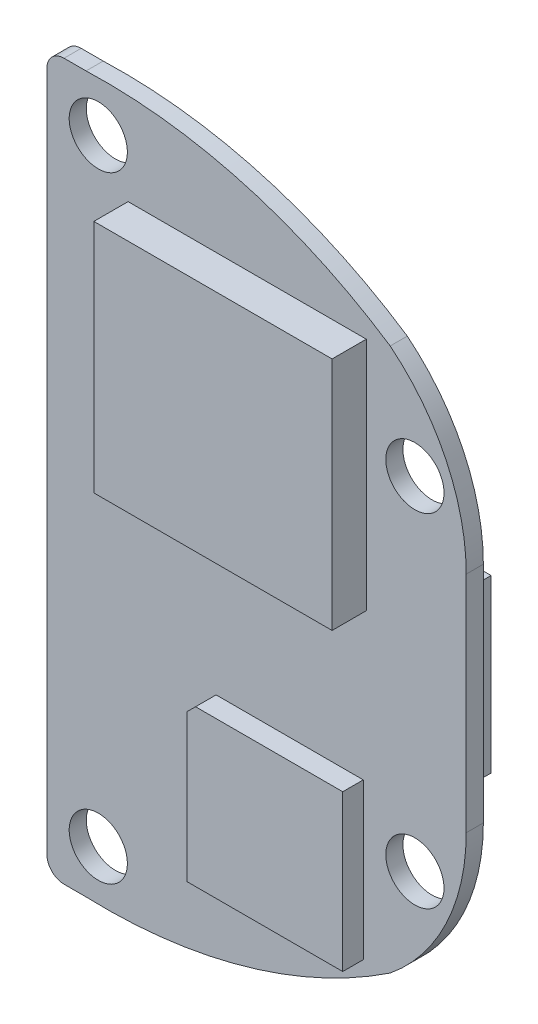
ISO-10303-21;
HEADER;
FILE_DESCRIPTION(('STEP AP214'),'2;1');
FILE_NAME('part.step','',(''),(''),'','','');
FILE_SCHEMA(('AUTOMOTIVE_DESIGN { 1 0 10303 214 1 1 1 1 }'));
ENDSEC;
DATA;
#1=APPLICATION_CONTEXT('core data for automotive mechanical design processes');
#2=APPLICATION_PROTOCOL_DEFINITION('international standard','automotive_design',2000,#1);
#3=PRODUCT_CONTEXT('',#1,'mechanical');
#4=PRODUCT('Part','Part','',(#3));
#5=PRODUCT_RELATED_PRODUCT_CATEGORY('part','',(#4));
#6=PRODUCT_DEFINITION_FORMATION('','',#4);
#7=PRODUCT_DEFINITION_CONTEXT('part definition',#1,'design');
#8=PRODUCT_DEFINITION('design','',#6,#7);
#9=PRODUCT_DEFINITION_SHAPE('','',#8);
#10=(LENGTH_UNIT() NAMED_UNIT(*) SI_UNIT(.MILLI.,.METRE.));
#11=(NAMED_UNIT(*) PLANE_ANGLE_UNIT() SI_UNIT($,.RADIAN.));
#12=(NAMED_UNIT(*) SI_UNIT($,.STERADIAN.) SOLID_ANGLE_UNIT());
#13=UNCERTAINTY_MEASURE_WITH_UNIT(LENGTH_MEASURE(1.E-05),#10,'distance_accuracy_value','');
#14=(GEOMETRIC_REPRESENTATION_CONTEXT(3) GLOBAL_UNCERTAINTY_ASSIGNED_CONTEXT((#13)) GLOBAL_UNIT_ASSIGNED_CONTEXT((#10,
#11,#12)) REPRESENTATION_CONTEXT('',''));
#15=CARTESIAN_POINT('',(0.,0.,0.));
#16=DIRECTION('',(0.,0.,1.));
#17=DIRECTION('',(1.,0.,0.));
#18=AXIS2_PLACEMENT_3D('',#15,#16,#17);
#19=CARTESIAN_POINT('',(0.,0.,1.7));
#20=DIRECTION('',(0.,0.,1.));
#21=DIRECTION('',(1.,0.,0.));
#22=AXIS2_PLACEMENT_3D('',#19,#20,#21);
#23=PLANE('',#22);
#24=DIRECTION('',(1.,0.,0.));
#25=VECTOR('',#24,1.);
#26=CARTESIAN_POINT('',(7.983496,-6.87576,1.7));
#27=LINE('',#26,#25);
#28=CARTESIAN_POINT('',(7.983496,-6.87576,1.7));
#29=VERTEX_POINT('',#28);
#30=CARTESIAN_POINT('',(-0.616436,-6.87576,1.7));
#31=VERTEX_POINT('',#30);
#32=EDGE_CURVE('E353',#29,#31,#27,.F.);
#33=ORIENTED_EDGE('',*,*,#32,.T.);
#34=DIRECTION('',(0.707106781186545,0.70710678118655,0.));
#35=VECTOR('',#34,1.);
#36=CARTESIAN_POINT('',(-0.616436,-6.87576,1.7));
#37=LINE('',#36,#35);
#38=CARTESIAN_POINT('',(-1.116308,-7.375632,1.7));
#39=VERTEX_POINT('',#38);
#40=EDGE_CURVE('E359',#31,#39,#37,.F.);
#41=ORIENTED_EDGE('',*,*,#40,.T.);
#42=DIRECTION('',(0.,1.,0.));
#43=VECTOR('',#42,1.);
#44=CARTESIAN_POINT('',(-1.116308,-7.375632,1.7));
#45=LINE('',#44,#43);
#46=CARTESIAN_POINT('',(-1.116308,-15.975564,1.7));
#47=VERTEX_POINT('',#46);
#48=EDGE_CURVE('E195',#39,#47,#45,.F.);
#49=ORIENTED_EDGE('',*,*,#48,.T.);
#50=DIRECTION('',(1.,0.,0.));
#51=VECTOR('',#50,1.);
#52=CARTESIAN_POINT('',(-1.116308,-15.975564,1.7));
#53=LINE('',#52,#51);
#54=CARTESIAN_POINT('',(7.983496,-15.975564,1.7));
#55=VERTEX_POINT('',#54);
#56=EDGE_CURVE('E177',#47,#55,#53,.T.);
#57=ORIENTED_EDGE('',*,*,#56,.T.);
#58=DIRECTION('',(0.,1.,0.));
#59=VECTOR('',#58,1.);
#60=CARTESIAN_POINT('',(7.983496,-15.975564,1.7));
#61=LINE('',#60,#59);
#62=EDGE_CURVE('E183',#55,#29,#61,.T.);
#63=ORIENTED_EDGE('',*,*,#62,.T.);
#64=EDGE_LOOP('',(#33,#41,#49,#57,#63));
#65=FACE_BOUND('',#64,.T.);
#66=ADVANCED_FACE('F17',(#65),#23,.T.);
#67=CARTESIAN_POINT('',(0.,0.,2.5));
#68=DIRECTION('',(0.,0.,-1.));
#69=DIRECTION('',(-1.,0.,0.));
#70=AXIS2_PLACEMENT_3D('',#67,#68,#69);
#71=PLANE('',#70);
#72=DIRECTION('',(0.,1.,0.));
#73=VECTOR('',#72,1.);
#74=CARTESIAN_POINT('',(8.161042,15.513578,2.5));
#75=LINE('',#74,#73);
#76=CARTESIAN_POINT('',(8.161042,1.773448,2.5));
#77=VERTEX_POINT('',#76);
#78=CARTESIAN_POINT('',(8.161042,15.513578,2.5));
#79=VERTEX_POINT('',#78);
#80=EDGE_CURVE('E345',#77,#79,#75,.T.);
#81=ORIENTED_EDGE('',*,*,#80,.T.);
#82=DIRECTION('',(1.,0.,0.));
#83=VECTOR('',#82,1.);
#84=CARTESIAN_POINT('',(-5.75892,15.513578,2.5));
#85=LINE('',#84,#83);
#86=CARTESIAN_POINT('',(-5.75892,15.513578,2.5));
#87=VERTEX_POINT('',#86);
#88=EDGE_CURVE('E348',#79,#87,#85,.F.);
#89=ORIENTED_EDGE('',*,*,#88,.T.);
#90=DIRECTION('',(0.,1.,0.));
#91=VECTOR('',#90,1.);
#92=CARTESIAN_POINT('',(-5.75892,1.773448,2.5));
#93=LINE('',#92,#91);
#94=CARTESIAN_POINT('',(-5.75892,1.773448,2.5));
#95=VERTEX_POINT('',#94);
#96=EDGE_CURVE('E330',#87,#95,#93,.F.);
#97=ORIENTED_EDGE('',*,*,#96,.T.);
#98=DIRECTION('',(1.,0.,0.));
#99=VECTOR('',#98,1.);
#100=CARTESIAN_POINT('',(8.161042,1.773448,2.5));
#101=LINE('',#100,#99);
#102=EDGE_CURVE('E339',#95,#77,#101,.T.);
#103=ORIENTED_EDGE('',*,*,#102,.T.);
#104=EDGE_LOOP('',(#81,#89,#97,#103));
#105=FACE_BOUND('',#104,.T.);
#106=ADVANCED_FACE('F492',(#105),#71,.F.);
#107=CARTESIAN_POINT('',(7.983496,-15.975564,1.7));
#108=DIRECTION('',(-1.,0.,0.));
#109=DIRECTION('',(0.,0.,1.));
#110=AXIS2_PLACEMENT_3D('',#107,#108,#109);
#111=PLANE('',#110);
#112=DIRECTION('',(0.,0.,-1.));
#113=VECTOR('',#112,1.);
#114=CARTESIAN_POINT('',(7.983496,-6.87576,1.7));
#115=LINE('',#114,#113);
#116=CARTESIAN_POINT('',(7.983496,-6.87576,0.5));
#117=VERTEX_POINT('',#116);
#118=EDGE_CURVE('E188',#117,#29,#115,.F.);
#119=ORIENTED_EDGE('',*,*,#118,.T.);
#120=ORIENTED_EDGE('',*,*,#62,.F.);
#121=DIRECTION('',(0.,0.,1.));
#122=VECTOR('',#121,1.);
#123=CARTESIAN_POINT('',(7.983496,-15.975564,1.7));
#124=LINE('',#123,#122);
#125=CARTESIAN_POINT('',(7.983496,-15.975564,0.5));
#126=VERTEX_POINT('',#125);
#127=EDGE_CURVE('E186',#55,#126,#124,.F.);
#128=ORIENTED_EDGE('',*,*,#127,.T.);
#129=DIRECTION('',(0.,1.,0.));
#130=VECTOR('',#129,1.);
#131=CARTESIAN_POINT('',(7.983496,0.,0.5));
#132=LINE('',#131,#130);
#133=EDGE_CURVE('E317',#117,#126,#132,.F.);
#134=ORIENTED_EDGE('',*,*,#133,.F.);
#135=EDGE_LOOP('',(#119,#120,#128,#134));
#136=FACE_BOUND('',#135,.T.);
#137=ADVANCED_FACE('F184',(#136),#111,.F.);
#138=CARTESIAN_POINT('',(-1.116308,-15.975564,1.7));
#139=DIRECTION('',(0.,1.,0.));
#140=DIRECTION('',(0.,0.,1.));
#141=AXIS2_PLACEMENT_3D('',#138,#139,#140);
#142=PLANE('',#141);
#143=ORIENTED_EDGE('',*,*,#56,.F.);
#144=DIRECTION('',(0.,0.,-1.));
#145=VECTOR('',#144,1.);
#146=CARTESIAN_POINT('',(-1.116308,-15.975564,1.7));
#147=LINE('',#146,#145);
#148=CARTESIAN_POINT('',(-1.116308,-15.975564,0.5));
#149=VERTEX_POINT('',#148);
#150=EDGE_CURVE('E361',#47,#149,#147,.T.);
#151=ORIENTED_EDGE('',*,*,#150,.T.);
#152=DIRECTION('',(1.,0.,0.));
#153=VECTOR('',#152,1.);
#154=CARTESIAN_POINT('',(0.,-15.975564,0.5));
#155=LINE('',#154,#153);
#156=EDGE_CURVE('E194',#126,#149,#155,.F.);
#157=ORIENTED_EDGE('',*,*,#156,.F.);
#158=ORIENTED_EDGE('',*,*,#127,.F.);
#159=EDGE_LOOP('',(#143,#151,#157,#158));
#160=FACE_BOUND('',#159,.T.);
#161=ADVANCED_FACE('F193',(#160),#142,.F.);
#162=CARTESIAN_POINT('',(-1.116308,-7.375632,1.7));
#163=DIRECTION('',(1.,0.,0.));
#164=DIRECTION('',(0.,0.,-1.));
#165=AXIS2_PLACEMENT_3D('',#162,#163,#164);
#166=PLANE('',#165);
#167=ORIENTED_EDGE('',*,*,#150,.F.);
#168=ORIENTED_EDGE('',*,*,#48,.F.);
#169=DIRECTION('',(0.,0.,1.));
#170=VECTOR('',#169,1.);
#171=CARTESIAN_POINT('',(-1.116308,-7.375632,1.7));
#172=LINE('',#171,#170);
#173=CARTESIAN_POINT('',(-1.116308,-7.375632,0.5));
#174=VERTEX_POINT('',#173);
#175=EDGE_CURVE('E356',#39,#174,#172,.F.);
#176=ORIENTED_EDGE('',*,*,#175,.T.);
#177=DIRECTION('',(0.,1.,0.));
#178=VECTOR('',#177,1.);
#179=CARTESIAN_POINT('',(-1.116308,0.,0.5));
#180=LINE('',#179,#178);
#181=EDGE_CURVE('E314',#149,#174,#180,.T.);
#182=ORIENTED_EDGE('',*,*,#181,.F.);
#183=EDGE_LOOP('',(#167,#168,#176,#182));
#184=FACE_BOUND('',#183,.T.);
#185=ADVANCED_FACE('F364',(#184),#166,.F.);
#186=CARTESIAN_POINT('',(-0.616436,-6.87576,1.7));
#187=DIRECTION('',(0.70710678118655,-0.707106781186545,0.));
#188=DIRECTION('',(0.707106781186545,0.70710678118655,0.));
#189=AXIS2_PLACEMENT_3D('',#186,#187,#188);
#190=PLANE('',#189);
#191=ORIENTED_EDGE('',*,*,#40,.F.);
#192=DIRECTION('',(0.,0.,-1.));
#193=VECTOR('',#192,1.);
#194=CARTESIAN_POINT('',(-0.616436,-6.87576,1.7));
#195=LINE('',#194,#193);
#196=CARTESIAN_POINT('',(-0.616436,-6.87576,0.5));
#197=VERTEX_POINT('',#196);
#198=EDGE_CURVE('E350',#31,#197,#195,.T.);
#199=ORIENTED_EDGE('',*,*,#198,.T.);
#200=DIRECTION('',(0.707106781186544,0.707106781186551,0.));
#201=VECTOR('',#200,1.);
#202=CARTESIAN_POINT('',(-1.116308,-7.375632,0.5));
#203=LINE('',#202,#201);
#204=EDGE_CURVE('E312',#174,#197,#203,.T.);
#205=ORIENTED_EDGE('',*,*,#204,.F.);
#206=ORIENTED_EDGE('',*,*,#175,.F.);
#207=EDGE_LOOP('',(#191,#199,#205,#206));
#208=FACE_BOUND('',#207,.T.);
#209=ADVANCED_FACE('F374',(#208),#190,.F.);
#210=CARTESIAN_POINT('',(7.983496,-6.87576,1.7));
#211=DIRECTION('',(0.,-1.,0.));
#212=DIRECTION('',(0.,0.,-1.));
#213=AXIS2_PLACEMENT_3D('',#210,#211,#212);
#214=PLANE('',#213);
#215=ORIENTED_EDGE('',*,*,#32,.F.);
#216=ORIENTED_EDGE('',*,*,#118,.F.);
#217=DIRECTION('',(1.,0.,0.));
#218=VECTOR('',#217,1.);
#219=CARTESIAN_POINT('',(0.,-6.87576,0.5));
#220=LINE('',#219,#218);
#221=EDGE_CURVE('E309',#197,#117,#220,.T.);
#222=ORIENTED_EDGE('',*,*,#221,.F.);
#223=ORIENTED_EDGE('',*,*,#198,.F.);
#224=EDGE_LOOP('',(#215,#216,#222,#223));
#225=FACE_BOUND('',#224,.T.);
#226=ADVANCED_FACE('F372',(#225),#214,.F.);
#227=CARTESIAN_POINT('',(-5.75892,15.513578,2.5));
#228=DIRECTION('',(0.,-1.,0.));
#229=DIRECTION('',(0.,0.,-1.));
#230=AXIS2_PLACEMENT_3D('',#227,#228,#229);
#231=PLANE('',#230);
#232=ORIENTED_EDGE('',*,*,#88,.F.);
#233=DIRECTION('',(0.,0.,1.));
#234=VECTOR('',#233,1.);
#235=CARTESIAN_POINT('',(8.161042,15.513578,2.5));
#236=LINE('',#235,#234);
#237=CARTESIAN_POINT('',(8.161042,15.513578,0.5));
#238=VERTEX_POINT('',#237);
#239=EDGE_CURVE('E342',#79,#238,#236,.F.);
#240=ORIENTED_EDGE('',*,*,#239,.T.);
#241=DIRECTION('',(1.,0.,0.));
#242=VECTOR('',#241,1.);
#243=CARTESIAN_POINT('',(0.,15.513578,0.5));
#244=LINE('',#243,#242);
#245=CARTESIAN_POINT('',(-5.75892,15.513578,0.5));
#246=VERTEX_POINT('',#245);
#247=EDGE_CURVE('E307',#246,#238,#244,.T.);
#248=ORIENTED_EDGE('',*,*,#247,.F.);
#249=DIRECTION('',(0.,0.,-1.));
#250=VECTOR('',#249,1.);
#251=CARTESIAN_POINT('',(-5.75892,15.513578,2.5));
#252=LINE('',#251,#250);
#253=EDGE_CURVE('E333',#246,#87,#252,.F.);
#254=ORIENTED_EDGE('',*,*,#253,.T.);
#255=EDGE_LOOP('',(#232,#240,#248,#254));
#256=FACE_BOUND('',#255,.T.);
#257=ADVANCED_FACE('F382',(#256),#231,.F.);
#258=CARTESIAN_POINT('',(8.161042,15.513578,2.5));
#259=DIRECTION('',(-1.,0.,0.));
#260=DIRECTION('',(0.,0.,1.));
#261=AXIS2_PLACEMENT_3D('',#258,#259,#260);
#262=PLANE('',#261);
#263=ORIENTED_EDGE('',*,*,#80,.F.);
#264=DIRECTION('',(0.,0.,1.));
#265=VECTOR('',#264,1.);
#266=CARTESIAN_POINT('',(8.161042,1.773448,2.5));
#267=LINE('',#266,#265);
#268=CARTESIAN_POINT('',(8.161042,1.773448,0.5));
#269=VERTEX_POINT('',#268);
#270=EDGE_CURVE('E336',#77,#269,#267,.F.);
#271=ORIENTED_EDGE('',*,*,#270,.T.);
#272=DIRECTION('',(0.,1.,0.));
#273=VECTOR('',#272,1.);
#274=CARTESIAN_POINT('',(8.161042,0.,0.5));
#275=LINE('',#274,#273);
#276=EDGE_CURVE('E305',#238,#269,#275,.F.);
#277=ORIENTED_EDGE('',*,*,#276,.F.);
#278=ORIENTED_EDGE('',*,*,#239,.F.);
#279=EDGE_LOOP('',(#263,#271,#277,#278));
#280=FACE_BOUND('',#279,.T.);
#281=ADVANCED_FACE('F477',(#280),#262,.F.);
#282=CARTESIAN_POINT('',(8.161042,1.773448,2.5));
#283=DIRECTION('',(0.,1.,0.));
#284=DIRECTION('',(0.,0.,1.));
#285=AXIS2_PLACEMENT_3D('',#282,#283,#284);
#286=PLANE('',#285);
#287=ORIENTED_EDGE('',*,*,#102,.F.);
#288=DIRECTION('',(0.,0.,-1.));
#289=VECTOR('',#288,1.);
#290=CARTESIAN_POINT('',(-5.75892,1.773448,2.5));
#291=LINE('',#290,#289);
#292=CARTESIAN_POINT('',(-5.75892,1.773448,0.5));
#293=VERTEX_POINT('',#292);
#294=EDGE_CURVE('E319',#95,#293,#291,.T.);
#295=ORIENTED_EDGE('',*,*,#294,.T.);
#296=DIRECTION('',(1.,0.,0.));
#297=VECTOR('',#296,1.);
#298=CARTESIAN_POINT('',(0.,1.773448,0.5));
#299=LINE('',#298,#297);
#300=EDGE_CURVE('E303',#269,#293,#299,.F.);
#301=ORIENTED_EDGE('',*,*,#300,.F.);
#302=ORIENTED_EDGE('',*,*,#270,.F.);
#303=EDGE_LOOP('',(#287,#295,#301,#302));
#304=FACE_BOUND('',#303,.T.);
#305=ADVANCED_FACE('F473',(#304),#286,.F.);
#306=CARTESIAN_POINT('',(-5.75892,1.773448,2.5));
#307=DIRECTION('',(1.,0.,0.));
#308=DIRECTION('',(0.,0.,-1.));
#309=AXIS2_PLACEMENT_3D('',#306,#307,#308);
#310=PLANE('',#309);
#311=ORIENTED_EDGE('',*,*,#96,.F.);
#312=ORIENTED_EDGE('',*,*,#253,.F.);
#313=DIRECTION('',(0.,1.,0.));
#314=VECTOR('',#313,1.);
#315=CARTESIAN_POINT('',(-5.75892,0.,0.5));
#316=LINE('',#315,#314);
#317=EDGE_CURVE('E300',#293,#246,#316,.T.);
#318=ORIENTED_EDGE('',*,*,#317,.F.);
#319=ORIENTED_EDGE('',*,*,#294,.F.);
#320=EDGE_LOOP('',(#311,#312,#318,#319));
#321=FACE_BOUND('',#320,.T.);
#322=ADVANCED_FACE('F469',(#321),#310,.F.);
#323=CARTESIAN_POINT('',(0.,0.,-1.7));
#324=DIRECTION('',(0.,0.,-1.));
#325=DIRECTION('',(-1.,0.,0.));
#326=AXIS2_PLACEMENT_3D('',#323,#324,#325);
#327=PLANE('',#326);
#328=DIRECTION('',(0.,1.,0.));
#329=VECTOR('',#328,1.);
#330=CARTESIAN_POINT('',(13.250186,5.00001000000001,-1.7));
#331=LINE('',#330,#329);
#332=CARTESIAN_POINT('',(13.250186,5.00001000000001,-1.7));
#333=VERTEX_POINT('',#332);
#334=CARTESIAN_POINT('',(13.250186,-4.99997,-1.7));
#335=VERTEX_POINT('',#334);
#336=EDGE_CURVE('E111',#333,#335,#331,.F.);
#337=ORIENTED_EDGE('',*,*,#336,.T.);
#338=DIRECTION('',(1.,0.,0.));
#339=VECTOR('',#338,1.);
#340=CARTESIAN_POINT('',(13.250186,-4.99997,-1.7));
#341=LINE('',#340,#339);
#342=CARTESIAN_POINT('',(2.650004,-4.99997,-1.7));
#343=VERTEX_POINT('',#342);
#344=EDGE_CURVE('E295',#335,#343,#341,.F.);
#345=ORIENTED_EDGE('',*,*,#344,.T.);
#346=DIRECTION('',(0.,1.,0.));
#347=VECTOR('',#346,1.);
#348=CARTESIAN_POINT('',(2.650004,5.00001000000001,-1.7));
#349=LINE('',#348,#347);
#350=CARTESIAN_POINT('',(2.650004,5.00001000000001,-1.7));
#351=VERTEX_POINT('',#350);
#352=EDGE_CURVE('E290',#343,#351,#349,.T.);
#353=ORIENTED_EDGE('',*,*,#352,.T.);
#354=DIRECTION('',(1.,0.,0.));
#355=VECTOR('',#354,1.);
#356=CARTESIAN_POINT('',(13.250186,5.00001000000001,-1.7));
#357=LINE('',#356,#355);
#358=EDGE_CURVE('E277',#351,#333,#357,.T.);
#359=ORIENTED_EDGE('',*,*,#358,.T.);
#360=EDGE_LOOP('',(#337,#345,#353,#359));
#361=FACE_BOUND('',#360,.T.);
#362=ADVANCED_FACE('F465',(#361),#327,.T.);
#363=CARTESIAN_POINT('',(0.,0.,0.5));
#364=DIRECTION('',(0.,0.,1.));
#365=DIRECTION('',(1.,0.,0.));
#366=AXIS2_PLACEMENT_3D('',#363,#364,#365);
#367=PLANE('',#366);
#368=ORIENTED_EDGE('',*,*,#300,.T.);
#369=ORIENTED_EDGE('',*,*,#317,.T.);
#370=ORIENTED_EDGE('',*,*,#247,.T.);
#371=ORIENTED_EDGE('',*,*,#276,.T.);
#372=EDGE_LOOP('',(#368,#369,#370,#371));
#373=FACE_BOUND('',#372,.T.);
#374=CARTESIAN_POINT('',(11.,10.,0.5));
#375=DIRECTION('',(0.,0.,1.));
#376=DIRECTION('',(1.,0.,0.));
#377=AXIS2_PLACEMENT_3D('',#374,#375,#376);
#378=CIRCLE('',#377,1.7);
#379=CARTESIAN_POINT('',(12.7,10.,0.5));
#380=VERTEX_POINT('',#379);
#381=EDGE_CURVE('E263',#380,#380,#378,.F.);
#382=ORIENTED_EDGE('',*,*,#381,.T.);
#383=EDGE_LOOP('',(#382));
#384=FACE_BOUND('',#383,.T.);
#385=CARTESIAN_POINT('',(11.,-10.,0.5));
#386=DIRECTION('',(0.,0.,1.));
#387=DIRECTION('',(1.,0.,0.));
#388=AXIS2_PLACEMENT_3D('',#385,#386,#387);
#389=CIRCLE('',#388,1.7);
#390=CARTESIAN_POINT('',(12.7,-10.,0.5));
#391=VERTEX_POINT('',#390);
#392=EDGE_CURVE('E265',#391,#391,#389,.F.);
#393=ORIENTED_EDGE('',*,*,#392,.T.);
#394=EDGE_LOOP('',(#393));
#395=FACE_BOUND('',#394,.T.);
#396=CARTESIAN_POINT('',(-7.5,18.,0.5));
#397=DIRECTION('',(0.,0.,1.));
#398=DIRECTION('',(1.,0.,0.));
#399=AXIS2_PLACEMENT_3D('',#396,#397,#398);
#400=CIRCLE('',#399,1.7);
#401=CARTESIAN_POINT('',(-5.8,18.,0.5));
#402=VERTEX_POINT('',#401);
#403=EDGE_CURVE('E234',#402,#402,#400,.F.);
#404=ORIENTED_EDGE('',*,*,#403,.T.);
#405=EDGE_LOOP('',(#404));
#406=FACE_BOUND('',#405,.T.);
#407=CARTESIAN_POINT('',(-7.49999999999999,-18.,0.5));
#408=DIRECTION('',(0.,0.,1.));
#409=DIRECTION('',(1.,0.,0.));
#410=AXIS2_PLACEMENT_3D('',#407,#408,#409);
#411=CIRCLE('',#410,1.7);
#412=CARTESIAN_POINT('',(-5.79999999999999,-18.,0.5));
#413=VERTEX_POINT('',#412);
#414=EDGE_CURVE('E20',#413,#413,#411,.F.);
#415=ORIENTED_EDGE('',*,*,#414,.T.);
#416=EDGE_LOOP('',(#415));
#417=FACE_BOUND('',#416,.T.);
#418=DIRECTION('',(-1.,0.,0.));
#419=VECTOR('',#418,1.);
#420=CARTESIAN_POINT('',(-8.21382999999999,20.900156,0.5));
#421=LINE('',#420,#419);
#422=CARTESIAN_POINT('',(-9.500086,20.900156,0.5));
#423=VERTEX_POINT('',#422);
#424=CARTESIAN_POINT('',(-8.21383000000021,20.900156,0.5));
#425=VERTEX_POINT('',#424);
#426=EDGE_CURVE('E102',#423,#425,#421,.F.);
#427=ORIENTED_EDGE('',*,*,#426,.F.);
#428=CARTESIAN_POINT('',(-9.50002926400854,19.9001012640085,0.5));
#429=DIRECTION('',(0.,0.,1.));
#430=DIRECTION('',(1.,0.,0.));
#431=AXIS2_PLACEMENT_3D('',#428,#429,#430);
#432=CIRCLE('',#431,1.00005473760086);
#433=CARTESIAN_POINT('',(-10.5,19.9130629521172,0.5));
#434=VERTEX_POINT('',#433);
#435=EDGE_CURVE('E255',#434,#423,#432,.F.);
#436=ORIENTED_EDGE('',*,*,#435,.F.);
#437=DIRECTION('',(0.,1.,0.));
#438=VECTOR('',#437,1.);
#439=CARTESIAN_POINT('',(-10.5,17.5,0.5));
#440=LINE('',#439,#438);
#441=CARTESIAN_POINT('',(-10.5,-19.9128093166315,0.5));
#442=VERTEX_POINT('',#441);
#443=EDGE_CURVE('E258',#434,#442,#440,.F.);
#444=ORIENTED_EDGE('',*,*,#443,.T.);
#445=CARTESIAN_POINT('',(-9.50007000687302,-19.899848006873,0.5));
#446=DIRECTION('',(0.,0.,1.));
#447=DIRECTION('',(1.,0.,0.));
#448=AXIS2_PLACEMENT_3D('',#445,#446,#447);
#449=CIRCLE('',#448,1.00001399325488);
#450=CARTESIAN_POINT('',(-9.500086,-20.899862,0.5));
#451=VERTEX_POINT('',#450);
#452=EDGE_CURVE('E250',#451,#442,#449,.F.);
#453=ORIENTED_EDGE('',*,*,#452,.F.);
#454=DIRECTION('',(1.,0.,0.));
#455=VECTOR('',#454,1.);
#456=CARTESIAN_POINT('',(-9.500086,-20.899862,0.5));
#457=LINE('',#456,#455);
#458=CARTESIAN_POINT('',(-8.21382999999998,-20.899862,0.5));
#459=VERTEX_POINT('',#458);
#460=EDGE_CURVE('E322',#459,#451,#457,.F.);
#461=ORIENTED_EDGE('',*,*,#460,.F.);
#462=CARTESIAN_POINT('',(-7.15900252002462,9.26161934420806,0.5));
#463=DIRECTION('',(0.,0.,1.));
#464=DIRECTION('',(1.,0.,0.));
#465=AXIS2_PLACEMENT_3D('',#462,#463,#464);
#466=CIRCLE('',#465,30.1799207734136);
#467=CARTESIAN_POINT('',(9.55397800000002,-15.868122,0.5));
#468=VERTEX_POINT('',#467);
#469=EDGE_CURVE('E246',#468,#459,#466,.F.);
#470=ORIENTED_EDGE('',*,*,#469,.F.);
#471=CARTESIAN_POINT('',(2.00001708960865,-6.54411425412743,0.5));
#472=DIRECTION('',(0.,0.,1.));
#473=DIRECTION('',(1.,0.,0.));
#474=AXIS2_PLACEMENT_3D('',#471,#472,#473);
#475=CIRCLE('',#474,11.9999769116783);
#476=CARTESIAN_POINT('',(13.999994,-6.54429,0.5));
#477=VERTEX_POINT('',#476);
#478=EDGE_CURVE('E242',#477,#468,#475,.F.);
#479=ORIENTED_EDGE('',*,*,#478,.F.);
#480=DIRECTION('',(0.,1.,0.));
#481=VECTOR('',#480,1.);
#482=CARTESIAN_POINT('',(13.999994,-6.54429,0.5));
#483=LINE('',#482,#481);
#484=CARTESIAN_POINT('',(13.9999940000003,6.54433359535493,0.5));
#485=VERTEX_POINT('',#484);
#486=EDGE_CURVE('E320',#485,#477,#483,.F.);
#487=ORIENTED_EDGE('',*,*,#486,.F.);
#488=CARTESIAN_POINT('',(2.0000351084364,6.54433359535492,0.5));
#489=DIRECTION('',(0.,0.,1.));
#490=DIRECTION('',(1.,0.,0.));
#491=AXIS2_PLACEMENT_3D('',#488,#489,#490);
#492=CIRCLE('',#491,11.9999588915641);
#493=CARTESIAN_POINT('',(9.55575599999998,15.866892,0.5));
#494=VERTEX_POINT('',#493);
#495=EDGE_CURVE('E239',#494,#485,#492,.F.);
#496=ORIENTED_EDGE('',*,*,#495,.F.);
#497=CARTESIAN_POINT('',(-7.15948767217951,-9.26133361884371,0.5));
#498=DIRECTION('',(0.,0.,1.));
#499=DIRECTION('',(1.,0.,0.));
#500=AXIS2_PLACEMENT_3D('',#497,#498,#499);
#501=CIRCLE('',#500,30.1799120901942);
#502=EDGE_CURVE('E260',#425,#494,#501,.F.);
#503=ORIENTED_EDGE('',*,*,#502,.F.);
#504=EDGE_LOOP('',(#427,#436,#444,#453,#461,#470,#479,#487,#496,#503));
#505=FACE_BOUND('',#504,.T.);
#506=ORIENTED_EDGE('',*,*,#204,.T.);
#507=ORIENTED_EDGE('',*,*,#221,.T.);
#508=ORIENTED_EDGE('',*,*,#133,.T.);
#509=ORIENTED_EDGE('',*,*,#156,.T.);
#510=ORIENTED_EDGE('',*,*,#181,.T.);
#511=EDGE_LOOP('',(#506,#507,#508,#509,#510));
#512=FACE_BOUND('',#511,.T.);
#513=ADVANCED_FACE('F368',(#373,#384,#395,#406,#417,#505,#512),#367,.T.);
#514=CARTESIAN_POINT('',(13.250186,5.00001000000001,-1.7));
#515=DIRECTION('',(-1.,0.,0.));
#516=DIRECTION('',(0.,0.,1.));
#517=AXIS2_PLACEMENT_3D('',#514,#515,#516);
#518=PLANE('',#517);
#519=ORIENTED_EDGE('',*,*,#336,.F.);
#520=DIRECTION('',(0.,0.,-1.));
#521=VECTOR('',#520,1.);
#522=CARTESIAN_POINT('',(13.250186,5.00001000000001,-1.7));
#523=LINE('',#522,#521);
#524=CARTESIAN_POINT('',(13.250186,5.00001000000001,-0.5));
#525=VERTEX_POINT('',#524);
#526=EDGE_CURVE('E271',#333,#525,#523,.F.);
#527=ORIENTED_EDGE('',*,*,#526,.T.);
#528=DIRECTION('',(0.,1.,0.));
#529=VECTOR('',#528,1.);
#530=CARTESIAN_POINT('',(13.250186,0.,-0.5));
#531=LINE('',#530,#529);
#532=CARTESIAN_POINT('',(13.250186,-4.99997,-0.5));
#533=VERTEX_POINT('',#532);
#534=EDGE_CURVE('E237',#525,#533,#531,.F.);
#535=ORIENTED_EDGE('',*,*,#534,.T.);
#536=DIRECTION('',(0.,0.,1.));
#537=VECTOR('',#536,1.);
#538=CARTESIAN_POINT('',(13.250186,-4.99997,-1.7));
#539=LINE('',#538,#537);
#540=EDGE_CURVE('E297',#533,#335,#539,.F.);
#541=ORIENTED_EDGE('',*,*,#540,.T.);
#542=EDGE_LOOP('',(#519,#527,#535,#541));
#543=FACE_BOUND('',#542,.T.);
#544=ADVANCED_FACE('F460',(#543),#518,.F.);
#545=CARTESIAN_POINT('',(13.250186,-4.99997,-1.7));
#546=DIRECTION('',(0.,1.,0.));
#547=DIRECTION('',(0.,0.,1.));
#548=AXIS2_PLACEMENT_3D('',#545,#546,#547);
#549=PLANE('',#548);
#550=ORIENTED_EDGE('',*,*,#344,.F.);
#551=ORIENTED_EDGE('',*,*,#540,.F.);
#552=DIRECTION('',(1.,0.,0.));
#553=VECTOR('',#552,1.);
#554=CARTESIAN_POINT('',(0.,-4.99997,-0.5));
#555=LINE('',#554,#553);
#556=CARTESIAN_POINT('',(2.650004,-4.99997,-0.5));
#557=VERTEX_POINT('',#556);
#558=EDGE_CURVE('E521',#533,#557,#555,.F.);
#559=ORIENTED_EDGE('',*,*,#558,.T.);
#560=DIRECTION('',(0.,0.,-1.));
#561=VECTOR('',#560,1.);
#562=CARTESIAN_POINT('',(2.650004,-4.99997,-1.7));
#563=LINE('',#562,#561);
#564=EDGE_CURVE('E292',#557,#343,#563,.T.);
#565=ORIENTED_EDGE('',*,*,#564,.T.);
#566=EDGE_LOOP('',(#550,#551,#559,#565));
#567=FACE_BOUND('',#566,.T.);
#568=ADVANCED_FACE('F456',(#567),#549,.F.);
#569=CARTESIAN_POINT('',(2.650004,5.00001000000001,-1.7));
#570=DIRECTION('',(1.,0.,0.));
#571=DIRECTION('',(0.,0.,-1.));
#572=AXIS2_PLACEMENT_3D('',#569,#570,#571);
#573=PLANE('',#572);
#574=ORIENTED_EDGE('',*,*,#352,.F.);
#575=ORIENTED_EDGE('',*,*,#564,.F.);
#576=DIRECTION('',(0.,1.,0.));
#577=VECTOR('',#576,1.);
#578=CARTESIAN_POINT('',(2.650004,0.,-0.5));
#579=LINE('',#578,#577);
#580=CARTESIAN_POINT('',(2.650004,5.00001000000001,-0.5));
#581=VERTEX_POINT('',#580);
#582=EDGE_CURVE('E524',#557,#581,#579,.T.);
#583=ORIENTED_EDGE('',*,*,#582,.T.);
#584=DIRECTION('',(0.,0.,-1.));
#585=VECTOR('',#584,1.);
#586=CARTESIAN_POINT('',(2.650004,5.00001000000001,-1.7));
#587=LINE('',#586,#585);
#588=EDGE_CURVE('E282',#581,#351,#587,.T.);
#589=ORIENTED_EDGE('',*,*,#588,.T.);
#590=EDGE_LOOP('',(#574,#575,#583,#589));
#591=FACE_BOUND('',#590,.T.);
#592=ADVANCED_FACE('F452',(#591),#573,.F.);
#593=CARTESIAN_POINT('',(13.250186,5.00001000000001,-1.7));
#594=DIRECTION('',(0.,-1.,0.));
#595=DIRECTION('',(0.,0.,-1.));
#596=AXIS2_PLACEMENT_3D('',#593,#594,#595);
#597=PLANE('',#596);
#598=ORIENTED_EDGE('',*,*,#358,.F.);
#599=ORIENTED_EDGE('',*,*,#588,.F.);
#600=DIRECTION('',(1.,0.,0.));
#601=VECTOR('',#600,1.);
#602=CARTESIAN_POINT('',(0.,5.00001000000001,-0.5));
#603=LINE('',#602,#601);
#604=EDGE_CURVE('E233',#581,#525,#603,.T.);
#605=ORIENTED_EDGE('',*,*,#604,.T.);
#606=ORIENTED_EDGE('',*,*,#526,.F.);
#607=EDGE_LOOP('',(#598,#599,#605,#606));
#608=FACE_BOUND('',#607,.T.);
#609=ADVANCED_FACE('F448',(#608),#597,.F.);
#610=CARTESIAN_POINT('',(-7.49999999999999,-18.,-1.5));
#611=DIRECTION('',(0.,0.,1.));
#612=DIRECTION('',(1.,0.,0.));
#613=AXIS2_PLACEMENT_3D('',#610,#611,#612);
#614=CYLINDRICAL_SURFACE('',#613,1.7);
#615=ORIENTED_EDGE('',*,*,#414,.F.);
#616=EDGE_LOOP('',(#615));
#617=FACE_BOUND('',#616,.T.);
#618=CARTESIAN_POINT('',(-7.49999999999999,-18.,-0.5));
#619=DIRECTION('',(0.,0.,1.));
#620=DIRECTION('',(1.,0.,0.));
#621=AXIS2_PLACEMENT_3D('',#618,#619,#620);
#622=CIRCLE('',#621,1.7);
#623=CARTESIAN_POINT('',(-5.79999999999999,-18.,-0.5));
#624=VERTEX_POINT('',#623);
#625=EDGE_CURVE('E230',#624,#624,#622,.F.);
#626=ORIENTED_EDGE('',*,*,#625,.T.);
#627=EDGE_LOOP('',(#626));
#628=FACE_BOUND('',#627,.T.);
#629=ADVANCED_FACE('F444',(#617,#628),#614,.F.);
#630=CARTESIAN_POINT('',(11.,-10.,-1.5));
#631=DIRECTION('',(0.,0.,1.));
#632=DIRECTION('',(1.,0.,0.));
#633=AXIS2_PLACEMENT_3D('',#630,#631,#632);
#634=CYLINDRICAL_SURFACE('',#633,1.7);
#635=ORIENTED_EDGE('',*,*,#392,.F.);
#636=EDGE_LOOP('',(#635));
#637=FACE_BOUND('',#636,.T.);
#638=CARTESIAN_POINT('',(11.,-10.,-0.5));
#639=DIRECTION('',(0.,0.,1.));
#640=DIRECTION('',(1.,0.,0.));
#641=AXIS2_PLACEMENT_3D('',#638,#639,#640);
#642=CIRCLE('',#641,1.7);
#643=CARTESIAN_POINT('',(12.7,-10.,-0.5));
#644=VERTEX_POINT('',#643);
#645=EDGE_CURVE('E227',#644,#644,#642,.F.);
#646=ORIENTED_EDGE('',*,*,#645,.T.);
#647=EDGE_LOOP('',(#646));
#648=FACE_BOUND('',#647,.T.);
#649=ADVANCED_FACE('F440',(#637,#648),#634,.F.);
#650=CARTESIAN_POINT('',(11.,10.,-1.5));
#651=DIRECTION('',(0.,0.,1.));
#652=DIRECTION('',(1.,0.,0.));
#653=AXIS2_PLACEMENT_3D('',#650,#651,#652);
#654=CYLINDRICAL_SURFACE('',#653,1.7);
#655=ORIENTED_EDGE('',*,*,#381,.F.);
#656=EDGE_LOOP('',(#655));
#657=FACE_BOUND('',#656,.T.);
#658=CARTESIAN_POINT('',(11.,10.,-0.5));
#659=DIRECTION('',(0.,0.,1.));
#660=DIRECTION('',(1.,0.,0.));
#661=AXIS2_PLACEMENT_3D('',#658,#659,#660);
#662=CIRCLE('',#661,1.7);
#663=CARTESIAN_POINT('',(12.7,10.,-0.5));
#664=VERTEX_POINT('',#663);
#665=EDGE_CURVE('E224',#664,#664,#662,.F.);
#666=ORIENTED_EDGE('',*,*,#665,.T.);
#667=EDGE_LOOP('',(#666));
#668=FACE_BOUND('',#667,.T.);
#669=ADVANCED_FACE('F436',(#657,#668),#654,.F.);
#670=CARTESIAN_POINT('',(-7.15948767217951,-9.26133361884371,-9.5));
#671=DIRECTION('',(0.,0.,1.));
#672=DIRECTION('',(1.,0.,0.));
#673=AXIS2_PLACEMENT_3D('',#670,#671,#672);
#674=CYLINDRICAL_SURFACE('',#673,30.1799120901942);
#675=CARTESIAN_POINT('',(-7.15948767217951,-9.26133361884371,-0.5));
#676=DIRECTION('',(0.,0.,1.));
#677=DIRECTION('',(1.,0.,0.));
#678=AXIS2_PLACEMENT_3D('',#675,#676,#677);
#679=CIRCLE('',#678,30.1799120901942);
#680=CARTESIAN_POINT('',(9.55575599999998,15.866892,-0.5));
#681=VERTEX_POINT('',#680);
#682=CARTESIAN_POINT('',(-8.21383000000019,20.900156,-0.5));
#683=VERTEX_POINT('',#682);
#684=EDGE_CURVE('E221',#681,#683,#679,.T.);
#685=ORIENTED_EDGE('',*,*,#684,.T.);
#686=DIRECTION('',(0.,0.,1.));
#687=VECTOR('',#686,1.);
#688=CARTESIAN_POINT('',(-8.21383000000009,20.900156,-9.5));
#689=LINE('',#688,#687);
#690=EDGE_CURVE('E285',#425,#683,#689,.F.);
#691=ORIENTED_EDGE('',*,*,#690,.F.);
#692=ORIENTED_EDGE('',*,*,#502,.T.);
#693=DIRECTION('',(0.,0.,1.));
#694=VECTOR('',#693,1.);
#695=CARTESIAN_POINT('',(9.55575599999998,15.866892,-9.5));
#696=LINE('',#695,#694);
#697=EDGE_CURVE('E238',#681,#494,#696,.T.);
#698=ORIENTED_EDGE('',*,*,#697,.F.);
#699=EDGE_LOOP('',(#685,#691,#692,#698));
#700=FACE_BOUND('',#699,.T.);
#701=ADVANCED_FACE('F433',(#700),#674,.T.);
#702=CARTESIAN_POINT('',(-8.21382999999999,20.900156,-9.5));
#703=DIRECTION('',(0.,1.,0.));
#704=DIRECTION('',(-1.,0.,0.));
#705=AXIS2_PLACEMENT_3D('',#702,#703,#704);
#706=PLANE('',#705);
#707=DIRECTION('',(1.,0.,0.));
#708=VECTOR('',#707,1.);
#709=CARTESIAN_POINT('',(0.,20.900156,-0.5));
#710=LINE('',#709,#708);
#711=CARTESIAN_POINT('',(-9.500086,20.900156,-0.5));
#712=VERTEX_POINT('',#711);
#713=EDGE_CURVE('E220',#683,#712,#710,.F.);
#714=ORIENTED_EDGE('',*,*,#713,.T.);
#715=DIRECTION('',(0.,0.,1.));
#716=VECTOR('',#715,1.);
#717=CARTESIAN_POINT('',(-9.500086,20.900156,-9.5));
#718=LINE('',#717,#716);
#719=EDGE_CURVE('E259',#423,#712,#718,.F.);
#720=ORIENTED_EDGE('',*,*,#719,.F.);
#721=ORIENTED_EDGE('',*,*,#426,.T.);
#722=ORIENTED_EDGE('',*,*,#690,.T.);
#723=EDGE_LOOP('',(#714,#720,#721,#722));
#724=FACE_BOUND('',#723,.T.);
#725=ADVANCED_FACE('F429',(#724),#706,.T.);
#726=CARTESIAN_POINT('',(-9.50002926400854,19.9001012640085,-9.5));
#727=DIRECTION('',(0.,0.,1.));
#728=DIRECTION('',(1.,0.,0.));
#729=AXIS2_PLACEMENT_3D('',#726,#727,#728);
#730=CYLINDRICAL_SURFACE('',#729,1.00005473760086);
#731=DIRECTION('',(0.,0.,1.));
#732=VECTOR('',#731,1.);
#733=CARTESIAN_POINT('',(-10.5,19.9130629521172,0.5));
#734=LINE('',#733,#732);
#735=CARTESIAN_POINT('',(-10.5,19.9130629521173,-0.5));
#736=VERTEX_POINT('',#735);
#737=EDGE_CURVE('E254',#736,#434,#734,.T.);
#738=ORIENTED_EDGE('',*,*,#737,.T.);
#739=ORIENTED_EDGE('',*,*,#435,.T.);
#740=ORIENTED_EDGE('',*,*,#719,.T.);
#741=CARTESIAN_POINT('',(-9.50002926400854,19.9001012640085,-0.5));
#742=DIRECTION('',(0.,0.,1.));
#743=DIRECTION('',(1.,0.,0.));
#744=AXIS2_PLACEMENT_3D('',#741,#742,#743);
#745=CIRCLE('',#744,1.00005473760086);
#746=EDGE_CURVE('E217',#712,#736,#745,.T.);
#747=ORIENTED_EDGE('',*,*,#746,.T.);
#748=EDGE_LOOP('',(#738,#739,#740,#747));
#749=FACE_BOUND('',#748,.T.);
#750=ADVANCED_FACE('F425',(#749),#730,.T.);
#751=CARTESIAN_POINT('',(-10.5,17.5,0.5));
#752=DIRECTION('',(1.,0.,0.));
#753=DIRECTION('',(0.,1.,0.));
#754=AXIS2_PLACEMENT_3D('',#751,#752,#753);
#755=PLANE('',#754);
#756=DIRECTION('',(0.,1.,0.));
#757=VECTOR('',#756,1.);
#758=CARTESIAN_POINT('',(-10.5,0.,-0.5));
#759=LINE('',#758,#757);
#760=CARTESIAN_POINT('',(-10.5,-19.9128093166309,-0.5));
#761=VERTEX_POINT('',#760);
#762=EDGE_CURVE('E216',#736,#761,#759,.F.);
#763=ORIENTED_EDGE('',*,*,#762,.T.);
#764=DIRECTION('',(0.,0.,1.));
#765=VECTOR('',#764,1.);
#766=CARTESIAN_POINT('',(-10.5,-19.9128093166315,-9.5));
#767=LINE('',#766,#765);
#768=EDGE_CURVE('E253',#442,#761,#767,.F.);
#769=ORIENTED_EDGE('',*,*,#768,.F.);
#770=ORIENTED_EDGE('',*,*,#443,.F.);
#771=ORIENTED_EDGE('',*,*,#737,.F.);
#772=EDGE_LOOP('',(#763,#769,#770,#771));
#773=FACE_BOUND('',#772,.T.);
#774=ADVANCED_FACE('F421',(#773),#755,.F.);
#775=CARTESIAN_POINT('',(-9.50007000687302,-19.899848006873,-9.5));
#776=DIRECTION('',(0.,0.,1.));
#777=DIRECTION('',(1.,0.,0.));
#778=AXIS2_PLACEMENT_3D('',#775,#776,#777);
#779=CYLINDRICAL_SURFACE('',#778,1.00001399325488);
#780=ORIENTED_EDGE('',*,*,#768,.T.);
#781=CARTESIAN_POINT('',(-9.50007000687302,-19.899848006873,-0.5));
#782=DIRECTION('',(0.,0.,1.));
#783=DIRECTION('',(1.,0.,0.));
#784=AXIS2_PLACEMENT_3D('',#781,#782,#783);
#785=CIRCLE('',#784,1.00001399325488);
#786=CARTESIAN_POINT('',(-9.500086,-20.899862,-0.5));
#787=VERTEX_POINT('',#786);
#788=EDGE_CURVE('E212',#761,#787,#785,.T.);
#789=ORIENTED_EDGE('',*,*,#788,.T.);
#790=DIRECTION('',(0.,0.,-1.));
#791=VECTOR('',#790,1.);
#792=CARTESIAN_POINT('',(-9.500086,-20.899862,-9.5));
#793=LINE('',#792,#791);
#794=EDGE_CURVE('E249',#451,#787,#793,.T.);
#795=ORIENTED_EDGE('',*,*,#794,.F.);
#796=ORIENTED_EDGE('',*,*,#452,.T.);
#797=EDGE_LOOP('',(#780,#789,#795,#796));
#798=FACE_BOUND('',#797,.T.);
#799=ADVANCED_FACE('F417',(#798),#779,.T.);
#800=CARTESIAN_POINT('',(-9.500086,-20.899862,-9.5));
#801=DIRECTION('',(0.,-1.,0.));
#802=DIRECTION('',(0.,0.,-1.));
#803=AXIS2_PLACEMENT_3D('',#800,#801,#802);
#804=PLANE('',#803);
#805=DIRECTION('',(1.,0.,0.));
#806=VECTOR('',#805,1.);
#807=CARTESIAN_POINT('',(0.,-20.899862,-0.5));
#808=LINE('',#807,#806);
#809=CARTESIAN_POINT('',(-8.21382999999998,-20.899862,-0.5));
#810=VERTEX_POINT('',#809);
#811=EDGE_CURVE('E211',#787,#810,#808,.T.);
#812=ORIENTED_EDGE('',*,*,#811,.T.);
#813=DIRECTION('',(0.,0.,1.));
#814=VECTOR('',#813,1.);
#815=CARTESIAN_POINT('',(-8.21382999999999,-20.899862,-9.5));
#816=LINE('',#815,#814);
#817=EDGE_CURVE('E245',#459,#810,#816,.F.);
#818=ORIENTED_EDGE('',*,*,#817,.F.);
#819=ORIENTED_EDGE('',*,*,#460,.T.);
#820=ORIENTED_EDGE('',*,*,#794,.T.);
#821=EDGE_LOOP('',(#812,#818,#819,#820));
#822=FACE_BOUND('',#821,.T.);
#823=ADVANCED_FACE('F413',(#822),#804,.T.);
#824=CARTESIAN_POINT('',(-7.15900252002462,9.26161934420806,-9.5));
#825=DIRECTION('',(0.,0.,1.));
#826=DIRECTION('',(1.,0.,0.));
#827=AXIS2_PLACEMENT_3D('',#824,#825,#826);
#828=CYLINDRICAL_SURFACE('',#827,30.1799207734136);
#829=CARTESIAN_POINT('',(-7.15900252002462,9.26161934420806,-0.5));
#830=DIRECTION('',(0.,0.,1.));
#831=DIRECTION('',(1.,0.,0.));
#832=AXIS2_PLACEMENT_3D('',#829,#830,#831);
#833=CIRCLE('',#832,30.1799207734136);
#834=CARTESIAN_POINT('',(9.55397800000002,-15.868122,-0.5));
#835=VERTEX_POINT('',#834);
#836=EDGE_CURVE('E207',#810,#835,#833,.T.);
#837=ORIENTED_EDGE('',*,*,#836,.T.);
#838=DIRECTION('',(0.,0.,1.));
#839=VECTOR('',#838,1.);
#840=CARTESIAN_POINT('',(9.55397800000001,-15.868122,-9.5));
#841=LINE('',#840,#839);
#842=EDGE_CURVE('E244',#468,#835,#841,.F.);
#843=ORIENTED_EDGE('',*,*,#842,.F.);
#844=ORIENTED_EDGE('',*,*,#469,.T.);
#845=ORIENTED_EDGE('',*,*,#817,.T.);
#846=EDGE_LOOP('',(#837,#843,#844,#845));
#847=FACE_BOUND('',#846,.T.);
#848=ADVANCED_FACE('F409',(#847),#828,.T.);
#849=CARTESIAN_POINT('',(2.00001708960865,-6.54411425412743,-9.5));
#850=DIRECTION('',(0.,0.,1.));
#851=DIRECTION('',(1.,0.,0.));
#852=AXIS2_PLACEMENT_3D('',#849,#850,#851);
#853=CYLINDRICAL_SURFACE('',#852,11.9999769116783);
#854=CARTESIAN_POINT('',(2.00001708960865,-6.54411425412743,-0.5));
#855=DIRECTION('',(0.,0.,1.));
#856=DIRECTION('',(1.,0.,0.));
#857=AXIS2_PLACEMENT_3D('',#854,#855,#856);
#858=CIRCLE('',#857,11.9999769116783);
#859=CARTESIAN_POINT('',(13.999994,-6.54429,-0.5));
#860=VERTEX_POINT('',#859);
#861=EDGE_CURVE('E204',#835,#860,#858,.T.);
#862=ORIENTED_EDGE('',*,*,#861,.T.);
#863=DIRECTION('',(0.,0.,1.));
#864=VECTOR('',#863,1.);
#865=CARTESIAN_POINT('',(13.999994,-6.54429,-9.5));
#866=LINE('',#865,#864);
#867=EDGE_CURVE('E241',#477,#860,#866,.F.);
#868=ORIENTED_EDGE('',*,*,#867,.F.);
#869=ORIENTED_EDGE('',*,*,#478,.T.);
#870=ORIENTED_EDGE('',*,*,#842,.T.);
#871=EDGE_LOOP('',(#862,#868,#869,#870));
#872=FACE_BOUND('',#871,.T.);
#873=ADVANCED_FACE('F405',(#872),#853,.T.);
#874=CARTESIAN_POINT('',(13.999994,-6.54429,-9.5));
#875=DIRECTION('',(1.,0.,0.));
#876=DIRECTION('',(0.,1.,0.));
#877=AXIS2_PLACEMENT_3D('',#874,#875,#876);
#878=PLANE('',#877);
#879=DIRECTION('',(0.,1.,0.));
#880=VECTOR('',#879,1.);
#881=CARTESIAN_POINT('',(13.999994,0.,-0.5));
#882=LINE('',#881,#880);
#883=CARTESIAN_POINT('',(13.9999940000003,6.54433359535492,-0.5));
#884=VERTEX_POINT('',#883);
#885=EDGE_CURVE('E203',#860,#884,#882,.T.);
#886=ORIENTED_EDGE('',*,*,#885,.T.);
#887=DIRECTION('',(0.,0.,1.));
#888=VECTOR('',#887,1.);
#889=CARTESIAN_POINT('',(13.9999940000005,6.54433359535492,-9.5));
#890=LINE('',#889,#888);
#891=EDGE_CURVE('E35',#485,#884,#890,.F.);
#892=ORIENTED_EDGE('',*,*,#891,.F.);
#893=ORIENTED_EDGE('',*,*,#486,.T.);
#894=ORIENTED_EDGE('',*,*,#867,.T.);
#895=EDGE_LOOP('',(#886,#892,#893,#894));
#896=FACE_BOUND('',#895,.T.);
#897=ADVANCED_FACE('F402',(#896),#878,.T.);
#898=CARTESIAN_POINT('',(2.0000351084364,6.54433359535492,-9.5));
#899=DIRECTION('',(0.,0.,1.));
#900=DIRECTION('',(1.,0.,0.));
#901=AXIS2_PLACEMENT_3D('',#898,#899,#900);
#902=CYLINDRICAL_SURFACE('',#901,11.9999588915641);
#903=CARTESIAN_POINT('',(2.0000351084364,6.54433359535492,-0.5));
#904=DIRECTION('',(0.,0.,1.));
#905=DIRECTION('',(1.,0.,0.));
#906=AXIS2_PLACEMENT_3D('',#903,#904,#905);
#907=CIRCLE('',#906,11.9999588915641);
#908=EDGE_CURVE('E26',#884,#681,#907,.T.);
#909=ORIENTED_EDGE('',*,*,#908,.T.);
#910=ORIENTED_EDGE('',*,*,#697,.T.);
#911=ORIENTED_EDGE('',*,*,#495,.T.);
#912=ORIENTED_EDGE('',*,*,#891,.T.);
#913=EDGE_LOOP('',(#909,#910,#911,#912));
#914=FACE_BOUND('',#913,.T.);
#915=ADVANCED_FACE('F394',(#914),#902,.T.);
#916=CARTESIAN_POINT('',(-7.5,18.,-1.5));
#917=DIRECTION('',(0.,0.,1.));
#918=DIRECTION('',(1.,0.,0.));
#919=AXIS2_PLACEMENT_3D('',#916,#917,#918);
#920=CYLINDRICAL_SURFACE('',#919,1.7);
#921=ORIENTED_EDGE('',*,*,#403,.F.);
#922=EDGE_LOOP('',(#921));
#923=FACE_BOUND('',#922,.T.);
#924=CARTESIAN_POINT('',(-7.5,18.,-0.5));
#925=DIRECTION('',(0.,0.,1.));
#926=DIRECTION('',(1.,0.,0.));
#927=AXIS2_PLACEMENT_3D('',#924,#925,#926);
#928=CIRCLE('',#927,1.7);
#929=CARTESIAN_POINT('',(-5.8,18.,-0.5));
#930=VERTEX_POINT('',#929);
#931=EDGE_CURVE('E11',#930,#930,#928,.F.);
#932=ORIENTED_EDGE('',*,*,#931,.T.);
#933=EDGE_LOOP('',(#932));
#934=FACE_BOUND('',#933,.T.);
#935=ADVANCED_FACE('F387',(#923,#934),#920,.F.);
#936=CARTESIAN_POINT('',(0.,0.,-0.5));
#937=DIRECTION('',(0.,0.,1.));
#938=DIRECTION('',(1.,0.,0.));
#939=AXIS2_PLACEMENT_3D('',#936,#937,#938);
#940=PLANE('',#939);
#941=ORIENTED_EDGE('',*,*,#931,.F.);
#942=EDGE_LOOP('',(#941));
#943=FACE_BOUND('',#942,.T.);
#944=ORIENTED_EDGE('',*,*,#885,.F.);
#945=ORIENTED_EDGE('',*,*,#861,.F.);
#946=ORIENTED_EDGE('',*,*,#836,.F.);
#947=ORIENTED_EDGE('',*,*,#811,.F.);
#948=ORIENTED_EDGE('',*,*,#788,.F.);
#949=ORIENTED_EDGE('',*,*,#762,.F.);
#950=ORIENTED_EDGE('',*,*,#746,.F.);
#951=ORIENTED_EDGE('',*,*,#713,.F.);
#952=ORIENTED_EDGE('',*,*,#684,.F.);
#953=ORIENTED_EDGE('',*,*,#908,.F.);
#954=EDGE_LOOP('',(#944,#945,#946,#947,#948,#949,#950,#951,#952,#953));
#955=FACE_BOUND('',#954,.T.);
#956=ORIENTED_EDGE('',*,*,#665,.F.);
#957=EDGE_LOOP('',(#956));
#958=FACE_BOUND('',#957,.T.);
#959=ORIENTED_EDGE('',*,*,#645,.F.);
#960=EDGE_LOOP('',(#959));
#961=FACE_BOUND('',#960,.T.);
#962=ORIENTED_EDGE('',*,*,#625,.F.);
#963=EDGE_LOOP('',(#962));
#964=FACE_BOUND('',#963,.T.);
#965=ORIENTED_EDGE('',*,*,#582,.F.);
#966=ORIENTED_EDGE('',*,*,#558,.F.);
#967=ORIENTED_EDGE('',*,*,#534,.F.);
#968=ORIENTED_EDGE('',*,*,#604,.F.);
#969=EDGE_LOOP('',(#965,#966,#967,#968));
#970=FACE_BOUND('',#969,.T.);
#971=ADVANCED_FACE('F385',(#943,#955,#958,#961,#964,#970),#940,.F.);
#972=CLOSED_SHELL('',(#66,#106,#137,#161,#185,#209,#226,#257,#281,#305,#322,#362,#513,#544,#568,
#592,#609,#629,#649,#669,#701,#725,#750,#774,#799,#823,#848,#873,#897,#915,#935,#971));
#973=MANIFOLD_SOLID_BREP('B1',#972);
#974=ADVANCED_BREP_SHAPE_REPRESENTATION('',(#18,#973),#14);
#975=SHAPE_DEFINITION_REPRESENTATION(#9,#974);
ENDSEC;
END-ISO-10303-21;
